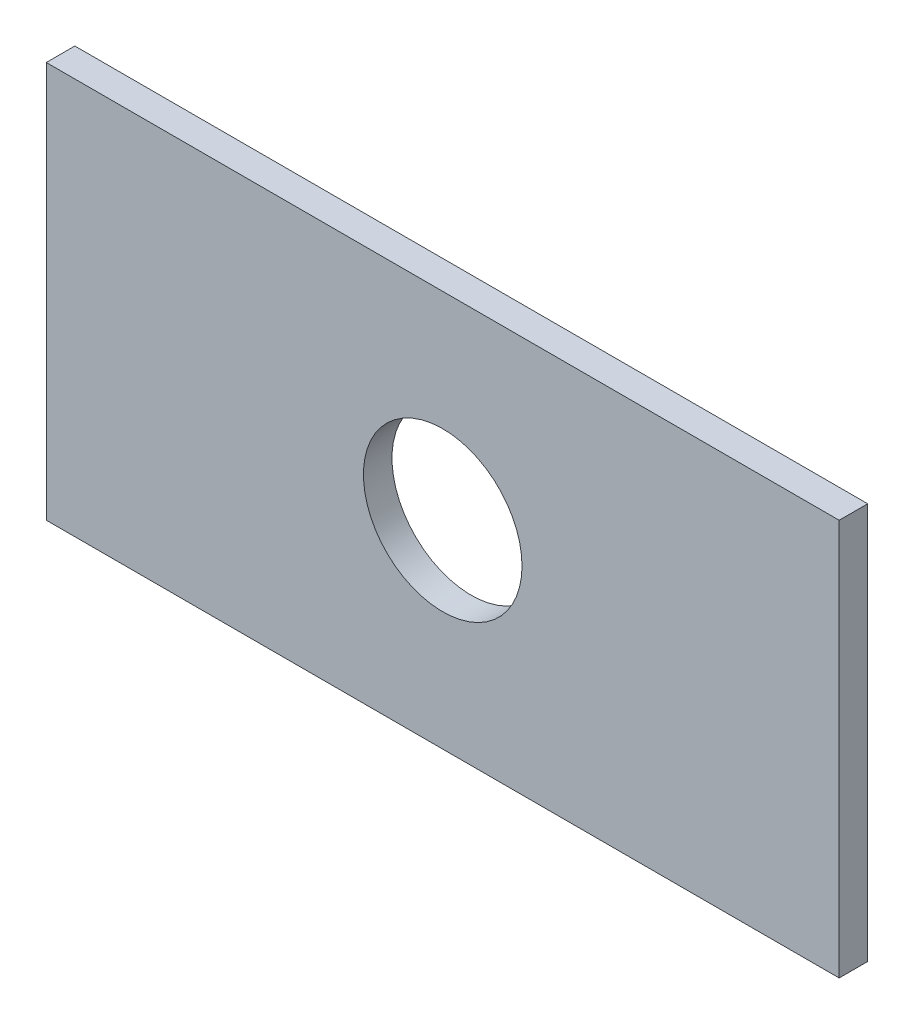
ISO-10303-21;
HEADER;
FILE_DESCRIPTION(('STEP AP214'),'2;1');
FILE_NAME('part.step','',(''),(''),'','','');
FILE_SCHEMA(('AUTOMOTIVE_DESIGN { 1 0 10303 214 1 1 1 1 }'));
ENDSEC;
DATA;
#1=APPLICATION_CONTEXT('core data for automotive mechanical design processes');
#2=APPLICATION_PROTOCOL_DEFINITION('international standard','automotive_design',2000,#1);
#3=PRODUCT_CONTEXT('',#1,'mechanical');
#4=PRODUCT('Part','Part','',(#3));
#5=PRODUCT_RELATED_PRODUCT_CATEGORY('part','',(#4));
#6=PRODUCT_DEFINITION_FORMATION('','',#4);
#7=PRODUCT_DEFINITION_CONTEXT('part definition',#1,'design');
#8=PRODUCT_DEFINITION('design','',#6,#7);
#9=PRODUCT_DEFINITION_SHAPE('','',#8);
#10=(LENGTH_UNIT() NAMED_UNIT(*) SI_UNIT(.MILLI.,.METRE.));
#11=(NAMED_UNIT(*) PLANE_ANGLE_UNIT() SI_UNIT($,.RADIAN.));
#12=(NAMED_UNIT(*) SI_UNIT($,.STERADIAN.) SOLID_ANGLE_UNIT());
#13=UNCERTAINTY_MEASURE_WITH_UNIT(LENGTH_MEASURE(1.E-05),#10,'distance_accuracy_value','');
#14=(GEOMETRIC_REPRESENTATION_CONTEXT(3) GLOBAL_UNCERTAINTY_ASSIGNED_CONTEXT((#13)) GLOBAL_UNIT_ASSIGNED_CONTEXT((#10,
#11,#12)) REPRESENTATION_CONTEXT('',''));
#15=CARTESIAN_POINT('',(0.,0.,0.));
#16=DIRECTION('',(0.,0.,1.));
#17=DIRECTION('',(1.,0.,0.));
#18=AXIS2_PLACEMENT_3D('',#15,#16,#17);
#19=CARTESIAN_POINT('',(-25.,12.5,1.8));
#20=DIRECTION('',(1.,0.,0.));
#21=DIRECTION('',(0.,0.,-1.));
#22=AXIS2_PLACEMENT_3D('',#19,#20,#21);
#23=PLANE('',#22);
#24=DIRECTION('',(0.,-1.,0.));
#25=VECTOR('',#24,1.);
#26=CARTESIAN_POINT('',(-25.,12.5,0.));
#27=LINE('',#26,#25);
#28=CARTESIAN_POINT('',(-25.,12.5,0.));
#29=VERTEX_POINT('',#28);
#30=CARTESIAN_POINT('',(-25.,-12.5,0.));
#31=VERTEX_POINT('',#30);
#32=EDGE_CURVE('E107',#29,#31,#27,.T.);
#33=ORIENTED_EDGE('',*,*,#32,.T.);
#34=DIRECTION('',(0.,0.,-1.));
#35=VECTOR('',#34,1.);
#36=CARTESIAN_POINT('',(-25.,-12.5,1.8));
#37=LINE('',#36,#35);
#38=CARTESIAN_POINT('',(-25.,-12.5,1.8));
#39=VERTEX_POINT('',#38);
#40=EDGE_CURVE('E11',#39,#31,#37,.T.);
#41=ORIENTED_EDGE('',*,*,#40,.F.);
#42=DIRECTION('',(0.,-1.,0.));
#43=VECTOR('',#42,1.);
#44=CARTESIAN_POINT('',(-25.,12.5,1.8));
#45=LINE('',#44,#43);
#46=CARTESIAN_POINT('',(-25.,12.5,1.8));
#47=VERTEX_POINT('',#46);
#48=EDGE_CURVE('E91',#47,#39,#45,.T.);
#49=ORIENTED_EDGE('',*,*,#48,.F.);
#50=DIRECTION('',(0.,0.,-1.));
#51=VECTOR('',#50,1.);
#52=CARTESIAN_POINT('',(-25.,12.5,1.8));
#53=LINE('',#52,#51);
#54=EDGE_CURVE('E103',#47,#29,#53,.T.);
#55=ORIENTED_EDGE('',*,*,#54,.T.);
#56=EDGE_LOOP('',(#33,#41,#49,#55));
#57=FACE_BOUND('',#56,.T.);
#58=ADVANCED_FACE('F39',(#57),#23,.F.);
#59=CARTESIAN_POINT('',(25.,-12.5,1.8));
#60=DIRECTION('',(0.,1.,0.));
#61=DIRECTION('',(-1.,0.,0.));
#62=AXIS2_PLACEMENT_3D('',#59,#60,#61);
#63=PLANE('',#62);
#64=DIRECTION('',(1.,0.,0.));
#65=VECTOR('',#64,1.);
#66=CARTESIAN_POINT('',(25.,-12.5,0.));
#67=LINE('',#66,#65);
#68=CARTESIAN_POINT('',(25.,-12.5,0.));
#69=VERTEX_POINT('',#68);
#70=EDGE_CURVE('E96',#31,#69,#67,.T.);
#71=ORIENTED_EDGE('',*,*,#70,.T.);
#72=DIRECTION('',(0.,0.,-1.));
#73=VECTOR('',#72,1.);
#74=CARTESIAN_POINT('',(25.,-12.5,1.8));
#75=LINE('',#74,#73);
#76=CARTESIAN_POINT('',(25.,-12.5,1.8));
#77=VERTEX_POINT('',#76);
#78=EDGE_CURVE('E48',#77,#69,#75,.T.);
#79=ORIENTED_EDGE('',*,*,#78,.F.);
#80=DIRECTION('',(1.,0.,0.));
#81=VECTOR('',#80,1.);
#82=CARTESIAN_POINT('',(25.,-12.5,1.8));
#83=LINE('',#82,#81);
#84=EDGE_CURVE('E86',#39,#77,#83,.T.);
#85=ORIENTED_EDGE('',*,*,#84,.F.);
#86=ORIENTED_EDGE('',*,*,#40,.T.);
#87=EDGE_LOOP('',(#71,#79,#85,#86));
#88=FACE_BOUND('',#87,.T.);
#89=ADVANCED_FACE('F95',(#88),#63,.F.);
#90=CARTESIAN_POINT('',(25.,12.5,1.8));
#91=DIRECTION('',(-1.,0.,0.));
#92=DIRECTION('',(0.,-1.,0.));
#93=AXIS2_PLACEMENT_3D('',#90,#91,#92);
#94=PLANE('',#93);
#95=DIRECTION('',(0.,1.,0.));
#96=VECTOR('',#95,1.);
#97=CARTESIAN_POINT('',(25.,12.5,0.));
#98=LINE('',#97,#96);
#99=CARTESIAN_POINT('',(25.,12.5,0.));
#100=VERTEX_POINT('',#99);
#101=EDGE_CURVE('E73',#69,#100,#98,.T.);
#102=ORIENTED_EDGE('',*,*,#101,.T.);
#103=DIRECTION('',(0.,0.,-1.));
#104=VECTOR('',#103,1.);
#105=CARTESIAN_POINT('',(25.,12.5,1.8));
#106=LINE('',#105,#104);
#107=CARTESIAN_POINT('',(25.,12.5,1.8));
#108=VERTEX_POINT('',#107);
#109=EDGE_CURVE('E98',#108,#100,#106,.T.);
#110=ORIENTED_EDGE('',*,*,#109,.F.);
#111=DIRECTION('',(0.,1.,0.));
#112=VECTOR('',#111,1.);
#113=CARTESIAN_POINT('',(25.,12.5,1.8));
#114=LINE('',#113,#112);
#115=EDGE_CURVE('E89',#77,#108,#114,.T.);
#116=ORIENTED_EDGE('',*,*,#115,.F.);
#117=ORIENTED_EDGE('',*,*,#78,.T.);
#118=EDGE_LOOP('',(#102,#110,#116,#117));
#119=FACE_BOUND('',#118,.T.);
#120=ADVANCED_FACE('F99',(#119),#94,.F.);
#121=CARTESIAN_POINT('',(25.,12.5,1.8));
#122=DIRECTION('',(0.,-1.,0.));
#123=DIRECTION('',(1.,0.,0.));
#124=AXIS2_PLACEMENT_3D('',#121,#122,#123);
#125=PLANE('',#124);
#126=DIRECTION('',(-1.,0.,0.));
#127=VECTOR('',#126,1.);
#128=CARTESIAN_POINT('',(25.,12.5,0.));
#129=LINE('',#128,#127);
#130=EDGE_CURVE('E79',#100,#29,#129,.T.);
#131=ORIENTED_EDGE('',*,*,#130,.T.);
#132=ORIENTED_EDGE('',*,*,#54,.F.);
#133=DIRECTION('',(-1.,0.,0.));
#134=VECTOR('',#133,1.);
#135=CARTESIAN_POINT('',(25.,12.5,1.8));
#136=LINE('',#135,#134);
#137=EDGE_CURVE('E56',#108,#47,#136,.T.);
#138=ORIENTED_EDGE('',*,*,#137,.F.);
#139=ORIENTED_EDGE('',*,*,#109,.T.);
#140=EDGE_LOOP('',(#131,#132,#138,#139));
#141=FACE_BOUND('',#140,.T.);
#142=ADVANCED_FACE('F121',(#141),#125,.F.);
#143=CARTESIAN_POINT('',(0.,0.,1.8));
#144=DIRECTION('',(0.,0.,-1.));
#145=DIRECTION('',(-1.,0.,0.));
#146=AXIS2_PLACEMENT_3D('',#143,#144,#145);
#147=PLANE('',#146);
#148=CARTESIAN_POINT('',(0.,0.,1.8));
#149=DIRECTION('',(0.,0.,1.));
#150=DIRECTION('',(1.,0.,0.));
#151=AXIS2_PLACEMENT_3D('',#148,#149,#150);
#152=CIRCLE('',#151,5.);
#153=CARTESIAN_POINT('',(5.,0.,1.8));
#154=VERTEX_POINT('',#153);
#155=EDGE_CURVE('E128',#154,#154,#152,.T.);
#156=ORIENTED_EDGE('',*,*,#155,.F.);
#157=EDGE_LOOP('',(#156));
#158=FACE_BOUND('',#157,.T.);
#159=ORIENTED_EDGE('',*,*,#48,.T.);
#160=ORIENTED_EDGE('',*,*,#84,.T.);
#161=ORIENTED_EDGE('',*,*,#115,.T.);
#162=ORIENTED_EDGE('',*,*,#137,.T.);
#163=EDGE_LOOP('',(#159,#160,#161,#162));
#164=FACE_BOUND('',#163,.T.);
#165=ADVANCED_FACE('F87',(#158,#164),#147,.F.);
#166=CARTESIAN_POINT('',(0.,0.,0.));
#167=DIRECTION('',(0.,0.,-1.));
#168=DIRECTION('',(-1.,0.,0.));
#169=AXIS2_PLACEMENT_3D('',#166,#167,#168);
#170=PLANE('',#169);
#171=CARTESIAN_POINT('',(0.,0.,0.));
#172=DIRECTION('',(0.,0.,1.));
#173=DIRECTION('',(1.,0.,0.));
#174=AXIS2_PLACEMENT_3D('',#171,#172,#173);
#175=CIRCLE('',#174,5.);
#176=CARTESIAN_POINT('',(5.,0.,0.));
#177=VERTEX_POINT('',#176);
#178=EDGE_CURVE('E111',#177,#177,#175,.T.);
#179=ORIENTED_EDGE('',*,*,#178,.T.);
#180=EDGE_LOOP('',(#179));
#181=FACE_BOUND('',#180,.T.);
#182=ORIENTED_EDGE('',*,*,#32,.F.);
#183=ORIENTED_EDGE('',*,*,#130,.F.);
#184=ORIENTED_EDGE('',*,*,#101,.F.);
#185=ORIENTED_EDGE('',*,*,#70,.F.);
#186=EDGE_LOOP('',(#182,#183,#184,#185));
#187=FACE_BOUND('',#186,.T.);
#188=ADVANCED_FACE('F124',(#181,#187),#170,.T.);
#189=CARTESIAN_POINT('',(0.,0.,0.));
#190=DIRECTION('',(0.,0.,1.));
#191=DIRECTION('',(1.,0.,0.));
#192=AXIS2_PLACEMENT_3D('',#189,#190,#191);
#193=CYLINDRICAL_SURFACE('',#192,5.);
#194=ORIENTED_EDGE('',*,*,#178,.F.);
#195=EDGE_LOOP('',(#194));
#196=FACE_BOUND('',#195,.T.);
#197=ORIENTED_EDGE('',*,*,#155,.T.);
#198=EDGE_LOOP('',(#197));
#199=FACE_BOUND('',#198,.T.);
#200=ADVANCED_FACE('F137',(#196,#199),#193,.F.);
#201=CLOSED_SHELL('',(#58,#89,#120,#142,#165,#188,#200));
#202=MANIFOLD_SOLID_BREP('B2',#201);
#203=ADVANCED_BREP_SHAPE_REPRESENTATION('',(#18,#202),#14);
#204=SHAPE_DEFINITION_REPRESENTATION(#9,#203);
ENDSEC;
END-ISO-10303-21;
